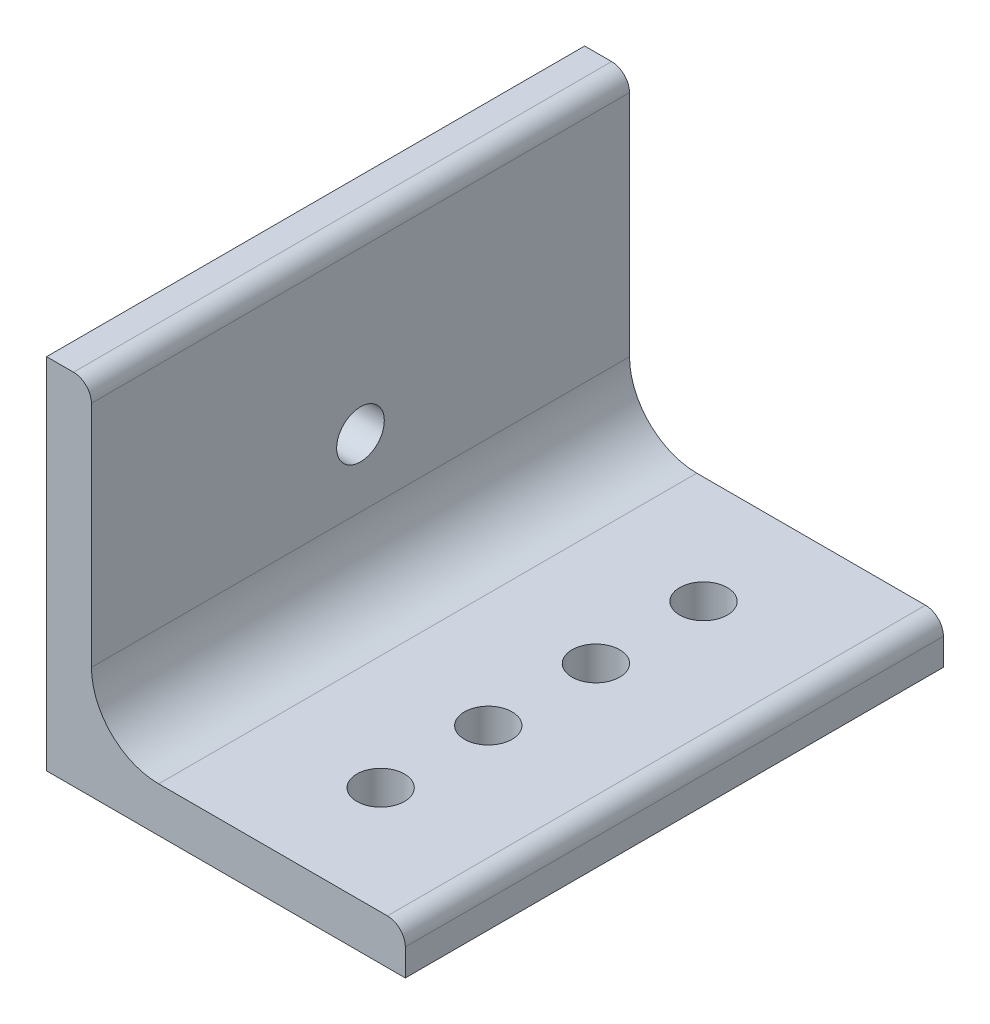
ISO-10303-21;
HEADER;
FILE_DESCRIPTION(('STEP AP214'),'2;1');
FILE_NAME('part.step','',(''),(''),'','','');
FILE_SCHEMA(('AUTOMOTIVE_DESIGN { 1 0 10303 214 1 1 1 1 }'));
ENDSEC;
DATA;
#1=APPLICATION_CONTEXT('core data for automotive mechanical design processes');
#2=APPLICATION_PROTOCOL_DEFINITION('international standard','automotive_design',2000,#1);
#3=PRODUCT_CONTEXT('',#1,'mechanical');
#4=PRODUCT('Part','Part','',(#3));
#5=PRODUCT_RELATED_PRODUCT_CATEGORY('part','',(#4));
#6=PRODUCT_DEFINITION_FORMATION('','',#4);
#7=PRODUCT_DEFINITION_CONTEXT('part definition',#1,'design');
#8=PRODUCT_DEFINITION('design','',#6,#7);
#9=PRODUCT_DEFINITION_SHAPE('','',#8);
#10=(LENGTH_UNIT() NAMED_UNIT(*) SI_UNIT(.MILLI.,.METRE.));
#11=(NAMED_UNIT(*) PLANE_ANGLE_UNIT() SI_UNIT($,.RADIAN.));
#12=(NAMED_UNIT(*) SI_UNIT($,.STERADIAN.) SOLID_ANGLE_UNIT());
#13=UNCERTAINTY_MEASURE_WITH_UNIT(LENGTH_MEASURE(1.E-05),#10,'distance_accuracy_value','');
#14=(GEOMETRIC_REPRESENTATION_CONTEXT(3) GLOBAL_UNCERTAINTY_ASSIGNED_CONTEXT((#13)) GLOBAL_UNIT_ASSIGNED_CONTEXT((#10,
#11,#12)) REPRESENTATION_CONTEXT('',''));
#15=CARTESIAN_POINT('',(0.,0.,0.));
#16=DIRECTION('',(0.,0.,1.));
#17=DIRECTION('',(1.,0.,0.));
#18=AXIS2_PLACEMENT_3D('',#15,#16,#17);
#19=CARTESIAN_POINT('',(19.05,19.05,76.2));
#20=DIRECTION('',(0.,0.,-1.));
#21=DIRECTION('',(-1.,0.,0.));
#22=AXIS2_PLACEMENT_3D('',#19,#20,#21);
#23=CYLINDRICAL_SURFACE('',#22,19.05);
#24=DIRECTION('',(0.,0.,-1.));
#25=VECTOR('',#24,1.);
#26=CARTESIAN_POINT('',(19.05,0.,76.2));
#27=LINE('',#26,#25);
#28=CARTESIAN_POINT('',(19.05,0.,76.2));
#29=VERTEX_POINT('',#28);
#30=CARTESIAN_POINT('',(19.05,0.,-76.2));
#31=VERTEX_POINT('',#30);
#32=EDGE_CURVE('E130',#29,#31,#27,.T.);
#33=ORIENTED_EDGE('',*,*,#32,.T.);
#34=CARTESIAN_POINT('',(19.05,19.05,-76.2));
#35=DIRECTION('',(0.,0.,-1.));
#36=DIRECTION('',(1.,0.,0.));
#37=AXIS2_PLACEMENT_3D('',#34,#35,#36);
#38=CIRCLE('',#37,19.05);
#39=CARTESIAN_POINT('',(0.,19.05,-76.2));
#40=VERTEX_POINT('',#39);
#41=EDGE_CURVE('E124',#31,#40,#38,.T.);
#42=ORIENTED_EDGE('',*,*,#41,.T.);
#43=DIRECTION('',(0.,0.,-1.));
#44=VECTOR('',#43,1.);
#45=CARTESIAN_POINT('',(0.,19.05,76.2));
#46=LINE('',#45,#44);
#47=CARTESIAN_POINT('',(0.,19.05,76.2));
#48=VERTEX_POINT('',#47);
#49=EDGE_CURVE('E11',#48,#40,#46,.T.);
#50=ORIENTED_EDGE('',*,*,#49,.F.);
#51=CARTESIAN_POINT('',(19.05,19.05,76.2));
#52=DIRECTION('',(0.,0.,-1.));
#53=DIRECTION('',(1.,0.,0.));
#54=AXIS2_PLACEMENT_3D('',#51,#52,#53);
#55=CIRCLE('',#54,19.05);
#56=EDGE_CURVE('E156',#29,#48,#55,.T.);
#57=ORIENTED_EDGE('',*,*,#56,.F.);
#58=EDGE_LOOP('',(#33,#42,#50,#57));
#59=FACE_BOUND('',#58,.T.);
#60=ADVANCED_FACE('F42',(#59),#23,.F.);
#61=CARTESIAN_POINT('',(0.,19.05,76.2));
#62=DIRECTION('',(-1.,0.,0.));
#63=DIRECTION('',(0.,-1.,0.));
#64=AXIS2_PLACEMENT_3D('',#61,#62,#63);
#65=PLANE('',#64);
#66=CARTESIAN_POINT('',(0.,38.1,0.));
#67=DIRECTION('',(1.,0.,0.));
#68=DIRECTION('',(0.,0.,-1.));
#69=AXIS2_PLACEMENT_3D('',#66,#67,#68);
#70=CIRCLE('',#69,6.75);
#71=CARTESIAN_POINT('',(0.,38.1,-6.75));
#72=VERTEX_POINT('',#71);
#73=EDGE_CURVE('E134',#72,#72,#70,.T.);
#74=ORIENTED_EDGE('',*,*,#73,.F.);
#75=EDGE_LOOP('',(#74));
#76=FACE_BOUND('',#75,.T.);
#77=ORIENTED_EDGE('',*,*,#49,.T.);
#78=DIRECTION('',(0.,1.,0.));
#79=VECTOR('',#78,1.);
#80=CARTESIAN_POINT('',(0.,19.05,-76.2));
#81=LINE('',#80,#79);
#82=CARTESIAN_POINT('',(0.,83.82,-76.2));
#83=VERTEX_POINT('',#82);
#84=EDGE_CURVE('E114',#40,#83,#81,.T.);
#85=ORIENTED_EDGE('',*,*,#84,.T.);
#86=DIRECTION('',(0.,0.,-1.));
#87=VECTOR('',#86,1.);
#88=CARTESIAN_POINT('',(0.,83.82,76.2));
#89=LINE('',#88,#87);
#90=CARTESIAN_POINT('',(0.,83.82,76.2));
#91=VERTEX_POINT('',#90);
#92=EDGE_CURVE('E49',#91,#83,#89,.T.);
#93=ORIENTED_EDGE('',*,*,#92,.F.);
#94=DIRECTION('',(0.,1.,0.));
#95=VECTOR('',#94,1.);
#96=CARTESIAN_POINT('',(0.,19.05,76.2));
#97=LINE('',#96,#95);
#98=EDGE_CURVE('E115',#48,#91,#97,.T.);
#99=ORIENTED_EDGE('',*,*,#98,.F.);
#100=EDGE_LOOP('',(#77,#85,#93,#99));
#101=FACE_BOUND('',#100,.T.);
#102=ADVANCED_FACE('F112',(#76,#101),#65,.F.);
#103=CARTESIAN_POINT('',(-5.08,83.82,76.2));
#104=DIRECTION('',(0.,0.,-1.));
#105=DIRECTION('',(-1.,0.,0.));
#106=AXIS2_PLACEMENT_3D('',#103,#104,#105);
#107=CYLINDRICAL_SURFACE('',#106,5.08);
#108=ORIENTED_EDGE('',*,*,#92,.T.);
#109=CARTESIAN_POINT('',(-5.08,83.82,-76.2));
#110=DIRECTION('',(0.,0.,1.));
#111=DIRECTION('',(1.,0.,0.));
#112=AXIS2_PLACEMENT_3D('',#109,#110,#111);
#113=CIRCLE('',#112,5.08);
#114=CARTESIAN_POINT('',(-5.08,88.9,-76.2));
#115=VERTEX_POINT('',#114);
#116=EDGE_CURVE('E128',#83,#115,#113,.T.);
#117=ORIENTED_EDGE('',*,*,#116,.T.);
#118=DIRECTION('',(0.,0.,-1.));
#119=VECTOR('',#118,1.);
#120=CARTESIAN_POINT('',(-5.08,88.9,76.2));
#121=LINE('',#120,#119);
#122=CARTESIAN_POINT('',(-5.08,88.9,76.2));
#123=VERTEX_POINT('',#122);
#124=EDGE_CURVE('E182',#123,#115,#121,.T.);
#125=ORIENTED_EDGE('',*,*,#124,.F.);
#126=CARTESIAN_POINT('',(-5.08,83.82,76.2));
#127=DIRECTION('',(0.,0.,1.));
#128=DIRECTION('',(1.,0.,0.));
#129=AXIS2_PLACEMENT_3D('',#126,#127,#128);
#130=CIRCLE('',#129,5.08);
#131=EDGE_CURVE('E159',#91,#123,#130,.T.);
#132=ORIENTED_EDGE('',*,*,#131,.F.);
#133=EDGE_LOOP('',(#108,#117,#125,#132));
#134=FACE_BOUND('',#133,.T.);
#135=ADVANCED_FACE('F185',(#134),#107,.T.);
#136=CARTESIAN_POINT('',(-5.08,88.9,76.2));
#137=DIRECTION('',(0.,-1.,0.));
#138=DIRECTION('',(0.,0.,-1.));
#139=AXIS2_PLACEMENT_3D('',#136,#137,#138);
#140=PLANE('',#139);
#141=ORIENTED_EDGE('',*,*,#124,.T.);
#142=DIRECTION('',(-1.,0.,0.));
#143=VECTOR('',#142,1.);
#144=CARTESIAN_POINT('',(-5.08,88.9,-76.2));
#145=LINE('',#144,#143);
#146=CARTESIAN_POINT('',(-12.7,88.9,-76.2));
#147=VERTEX_POINT('',#146);
#148=EDGE_CURVE('E139',#115,#147,#145,.T.);
#149=ORIENTED_EDGE('',*,*,#148,.T.);
#150=DIRECTION('',(0.,0.,-1.));
#151=VECTOR('',#150,1.);
#152=CARTESIAN_POINT('',(-12.7,88.9,76.2));
#153=LINE('',#152,#151);
#154=CARTESIAN_POINT('',(-12.7,88.9,76.2));
#155=VERTEX_POINT('',#154);
#156=EDGE_CURVE('E180',#155,#147,#153,.T.);
#157=ORIENTED_EDGE('',*,*,#156,.F.);
#158=DIRECTION('',(-1.,0.,0.));
#159=VECTOR('',#158,1.);
#160=CARTESIAN_POINT('',(-5.08,88.9,76.2));
#161=LINE('',#160,#159);
#162=EDGE_CURVE('E161',#123,#155,#161,.T.);
#163=ORIENTED_EDGE('',*,*,#162,.F.);
#164=EDGE_LOOP('',(#141,#149,#157,#163));
#165=FACE_BOUND('',#164,.T.);
#166=ADVANCED_FACE('F193',(#165),#140,.F.);
#167=CARTESIAN_POINT('',(-12.7,88.9,76.2));
#168=DIRECTION('',(1.,0.,0.));
#169=DIRECTION('',(0.,1.,0.));
#170=AXIS2_PLACEMENT_3D('',#167,#168,#169);
#171=PLANE('',#170);
#172=CARTESIAN_POINT('',(-12.7,38.1,0.));
#173=DIRECTION('',(1.,0.,0.));
#174=DIRECTION('',(0.,0.,-1.));
#175=AXIS2_PLACEMENT_3D('',#172,#173,#174);
#176=CIRCLE('',#175,6.75);
#177=CARTESIAN_POINT('',(-12.7,38.1,-6.75));
#178=VERTEX_POINT('',#177);
#179=EDGE_CURVE('E131',#178,#178,#176,.T.);
#180=ORIENTED_EDGE('',*,*,#179,.T.);
#181=EDGE_LOOP('',(#180));
#182=FACE_BOUND('',#181,.T.);
#183=ORIENTED_EDGE('',*,*,#156,.T.);
#184=DIRECTION('',(0.,-1.,0.));
#185=VECTOR('',#184,1.);
#186=CARTESIAN_POINT('',(-12.7,88.9,-76.2));
#187=LINE('',#186,#185);
#188=CARTESIAN_POINT('',(-12.7,-12.7,-76.2));
#189=VERTEX_POINT('',#188);
#190=EDGE_CURVE('E142',#147,#189,#187,.T.);
#191=ORIENTED_EDGE('',*,*,#190,.T.);
#192=DIRECTION('',(0.,0.,-1.));
#193=VECTOR('',#192,1.);
#194=CARTESIAN_POINT('',(-12.7,-12.7,76.2));
#195=LINE('',#194,#193);
#196=CARTESIAN_POINT('',(-12.7,-12.7,76.2));
#197=VERTEX_POINT('',#196);
#198=EDGE_CURVE('E178',#197,#189,#195,.T.);
#199=ORIENTED_EDGE('',*,*,#198,.F.);
#200=DIRECTION('',(0.,-1.,0.));
#201=VECTOR('',#200,1.);
#202=CARTESIAN_POINT('',(-12.7,88.9,76.2));
#203=LINE('',#202,#201);
#204=EDGE_CURVE('E163',#155,#197,#203,.T.);
#205=ORIENTED_EDGE('',*,*,#204,.F.);
#206=EDGE_LOOP('',(#183,#191,#199,#205));
#207=FACE_BOUND('',#206,.T.);
#208=ADVANCED_FACE('F196',(#182,#207),#171,.F.);
#209=CARTESIAN_POINT('',(-12.7,-12.7,76.2));
#210=DIRECTION('',(0.,1.,0.));
#211=DIRECTION('',(-1.,0.,0.));
#212=AXIS2_PLACEMENT_3D('',#209,#210,#211);
#213=PLANE('',#212);
#214=CARTESIAN_POINT('',(51.435,-12.7,-45.72));
#215=DIRECTION('',(0.,1.,0.));
#216=DIRECTION('',(0.,0.,1.));
#217=AXIS2_PLACEMENT_3D('',#214,#215,#216);
#218=CIRCLE('',#217,6.74623999999999);
#219=CARTESIAN_POINT('',(51.435,-12.7,-38.97376));
#220=VERTEX_POINT('',#219);
#221=EDGE_CURVE('E322',#220,#220,#218,.T.);
#222=ORIENTED_EDGE('',*,*,#221,.T.);
#223=EDGE_LOOP('',(#222));
#224=FACE_BOUND('',#223,.T.);
#225=CARTESIAN_POINT('',(51.435,-12.7,-15.24));
#226=DIRECTION('',(0.,1.,0.));
#227=DIRECTION('',(0.,0.,1.));
#228=AXIS2_PLACEMENT_3D('',#225,#226,#227);
#229=CIRCLE('',#228,6.74623999999999);
#230=CARTESIAN_POINT('',(51.435,-12.7,-8.49376000000002));
#231=VERTEX_POINT('',#230);
#232=EDGE_CURVE('E331',#231,#231,#229,.T.);
#233=ORIENTED_EDGE('',*,*,#232,.T.);
#234=EDGE_LOOP('',(#233));
#235=FACE_BOUND('',#234,.T.);
#236=CARTESIAN_POINT('',(51.435,-12.7,15.24));
#237=DIRECTION('',(0.,1.,0.));
#238=DIRECTION('',(0.,0.,1.));
#239=AXIS2_PLACEMENT_3D('',#236,#237,#238);
#240=CIRCLE('',#239,6.74624);
#241=CARTESIAN_POINT('',(51.435,-12.7,21.98624));
#242=VERTEX_POINT('',#241);
#243=EDGE_CURVE('E337',#242,#242,#240,.T.);
#244=ORIENTED_EDGE('',*,*,#243,.T.);
#245=EDGE_LOOP('',(#244));
#246=FACE_BOUND('',#245,.T.);
#247=CARTESIAN_POINT('',(51.435,-12.7,45.72));
#248=DIRECTION('',(0.,1.,0.));
#249=DIRECTION('',(0.,0.,1.));
#250=AXIS2_PLACEMENT_3D('',#247,#248,#249);
#251=CIRCLE('',#250,6.74624);
#252=CARTESIAN_POINT('',(51.435,-12.7,52.46624));
#253=VERTEX_POINT('',#252);
#254=EDGE_CURVE('E343',#253,#253,#251,.T.);
#255=ORIENTED_EDGE('',*,*,#254,.T.);
#256=EDGE_LOOP('',(#255));
#257=FACE_BOUND('',#256,.T.);
#258=ORIENTED_EDGE('',*,*,#198,.T.);
#259=DIRECTION('',(1.,0.,0.));
#260=VECTOR('',#259,1.);
#261=CARTESIAN_POINT('',(-12.7,-12.7,-76.2));
#262=LINE('',#261,#260);
#263=CARTESIAN_POINT('',(88.9,-12.7,-76.2));
#264=VERTEX_POINT('',#263);
#265=EDGE_CURVE('E145',#189,#264,#262,.T.);
#266=ORIENTED_EDGE('',*,*,#265,.T.);
#267=DIRECTION('',(0.,0.,-1.));
#268=VECTOR('',#267,1.);
#269=CARTESIAN_POINT('',(88.9,-12.7,76.2));
#270=LINE('',#269,#268);
#271=CARTESIAN_POINT('',(88.9,-12.7,76.2));
#272=VERTEX_POINT('',#271);
#273=EDGE_CURVE('E176',#272,#264,#270,.T.);
#274=ORIENTED_EDGE('',*,*,#273,.F.);
#275=DIRECTION('',(1.,0.,0.));
#276=VECTOR('',#275,1.);
#277=CARTESIAN_POINT('',(-12.7,-12.7,76.2));
#278=LINE('',#277,#276);
#279=EDGE_CURVE('E165',#197,#272,#278,.T.);
#280=ORIENTED_EDGE('',*,*,#279,.F.);
#281=EDGE_LOOP('',(#258,#266,#274,#280));
#282=FACE_BOUND('',#281,.T.);
#283=ADVANCED_FACE('F201',(#224,#235,#246,#257,#282),#213,.F.);
#284=CARTESIAN_POINT('',(88.9,-12.7,76.2));
#285=DIRECTION('',(-1.,0.,0.));
#286=DIRECTION('',(0.,0.,1.));
#287=AXIS2_PLACEMENT_3D('',#284,#285,#286);
#288=PLANE('',#287);
#289=ORIENTED_EDGE('',*,*,#273,.T.);
#290=DIRECTION('',(0.,1.,0.));
#291=VECTOR('',#290,1.);
#292=CARTESIAN_POINT('',(88.9,-12.7,-76.2));
#293=LINE('',#292,#291);
#294=CARTESIAN_POINT('',(88.9,-5.08,-76.2));
#295=VERTEX_POINT('',#294);
#296=EDGE_CURVE('E148',#264,#295,#293,.T.);
#297=ORIENTED_EDGE('',*,*,#296,.T.);
#298=DIRECTION('',(0.,0.,-1.));
#299=VECTOR('',#298,1.);
#300=CARTESIAN_POINT('',(88.9,-5.08,76.2));
#301=LINE('',#300,#299);
#302=CARTESIAN_POINT('',(88.9,-5.08,76.2));
#303=VERTEX_POINT('',#302);
#304=EDGE_CURVE('E174',#303,#295,#301,.T.);
#305=ORIENTED_EDGE('',*,*,#304,.F.);
#306=DIRECTION('',(0.,1.,0.));
#307=VECTOR('',#306,1.);
#308=CARTESIAN_POINT('',(88.9,-12.7,76.2));
#309=LINE('',#308,#307);
#310=EDGE_CURVE('E167',#272,#303,#309,.T.);
#311=ORIENTED_EDGE('',*,*,#310,.F.);
#312=EDGE_LOOP('',(#289,#297,#305,#311));
#313=FACE_BOUND('',#312,.T.);
#314=ADVANCED_FACE('F205',(#313),#288,.F.);
#315=CARTESIAN_POINT('',(83.82,-5.08,76.2));
#316=DIRECTION('',(0.,0.,-1.));
#317=DIRECTION('',(-1.,0.,0.));
#318=AXIS2_PLACEMENT_3D('',#315,#316,#317);
#319=CYLINDRICAL_SURFACE('',#318,5.08);
#320=ORIENTED_EDGE('',*,*,#304,.T.);
#321=CARTESIAN_POINT('',(83.82,-5.08,-76.2));
#322=DIRECTION('',(0.,0.,1.));
#323=DIRECTION('',(1.,0.,0.));
#324=AXIS2_PLACEMENT_3D('',#321,#322,#323);
#325=CIRCLE('',#324,5.08);
#326=CARTESIAN_POINT('',(83.82,0.,-76.2));
#327=VERTEX_POINT('',#326);
#328=EDGE_CURVE('E151',#295,#327,#325,.T.);
#329=ORIENTED_EDGE('',*,*,#328,.T.);
#330=DIRECTION('',(0.,0.,-1.));
#331=VECTOR('',#330,1.);
#332=CARTESIAN_POINT('',(83.82,0.,76.2));
#333=LINE('',#332,#331);
#334=CARTESIAN_POINT('',(83.82,0.,76.2));
#335=VERTEX_POINT('',#334);
#336=EDGE_CURVE('E172',#335,#327,#333,.T.);
#337=ORIENTED_EDGE('',*,*,#336,.F.);
#338=CARTESIAN_POINT('',(83.82,-5.08,76.2));
#339=DIRECTION('',(0.,0.,1.));
#340=DIRECTION('',(1.,0.,0.));
#341=AXIS2_PLACEMENT_3D('',#338,#339,#340);
#342=CIRCLE('',#341,5.08);
#343=EDGE_CURVE('E61',#303,#335,#342,.T.);
#344=ORIENTED_EDGE('',*,*,#343,.F.);
#345=EDGE_LOOP('',(#320,#329,#337,#344));
#346=FACE_BOUND('',#345,.T.);
#347=ADVANCED_FACE('F209',(#346),#319,.T.);
#348=CARTESIAN_POINT('',(83.82,0.,76.2));
#349=DIRECTION('',(0.,-1.,0.));
#350=DIRECTION('',(1.,0.,0.));
#351=AXIS2_PLACEMENT_3D('',#348,#349,#350);
#352=PLANE('',#351);
#353=CARTESIAN_POINT('',(51.435,0.,-45.72));
#354=DIRECTION('',(0.,1.,0.));
#355=DIRECTION('',(0.,0.,1.));
#356=AXIS2_PLACEMENT_3D('',#353,#354,#355);
#357=CIRCLE('',#356,6.74624);
#358=CARTESIAN_POINT('',(51.435,0.,-38.97376));
#359=VERTEX_POINT('',#358);
#360=EDGE_CURVE('E324',#359,#359,#357,.T.);
#361=ORIENTED_EDGE('',*,*,#360,.F.);
#362=EDGE_LOOP('',(#361));
#363=FACE_BOUND('',#362,.T.);
#364=CARTESIAN_POINT('',(51.435,0.,-15.24));
#365=DIRECTION('',(0.,1.,0.));
#366=DIRECTION('',(0.,0.,1.));
#367=AXIS2_PLACEMENT_3D('',#364,#365,#366);
#368=CIRCLE('',#367,6.74624);
#369=CARTESIAN_POINT('',(51.435,0.,-8.49376000000002));
#370=VERTEX_POINT('',#369);
#371=EDGE_CURVE('E326',#370,#370,#368,.T.);
#372=ORIENTED_EDGE('',*,*,#371,.F.);
#373=EDGE_LOOP('',(#372));
#374=FACE_BOUND('',#373,.T.);
#375=CARTESIAN_POINT('',(51.435,0.,15.24));
#376=DIRECTION('',(0.,1.,0.));
#377=DIRECTION('',(0.,0.,1.));
#378=AXIS2_PLACEMENT_3D('',#375,#376,#377);
#379=CIRCLE('',#378,6.74624);
#380=CARTESIAN_POINT('',(51.435,0.,21.98624));
#381=VERTEX_POINT('',#380);
#382=EDGE_CURVE('E334',#381,#381,#379,.T.);
#383=ORIENTED_EDGE('',*,*,#382,.F.);
#384=EDGE_LOOP('',(#383));
#385=FACE_BOUND('',#384,.T.);
#386=CARTESIAN_POINT('',(51.435,0.,45.72));
#387=DIRECTION('',(0.,1.,0.));
#388=DIRECTION('',(0.,0.,1.));
#389=AXIS2_PLACEMENT_3D('',#386,#387,#388);
#390=CIRCLE('',#389,6.74624);
#391=CARTESIAN_POINT('',(51.435,0.,52.46624));
#392=VERTEX_POINT('',#391);
#393=EDGE_CURVE('E340',#392,#392,#390,.T.);
#394=ORIENTED_EDGE('',*,*,#393,.F.);
#395=EDGE_LOOP('',(#394));
#396=FACE_BOUND('',#395,.T.);
#397=ORIENTED_EDGE('',*,*,#336,.T.);
#398=DIRECTION('',(-1.,0.,0.));
#399=VECTOR('',#398,1.);
#400=CARTESIAN_POINT('',(83.82,0.,-76.2));
#401=LINE('',#400,#399);
#402=EDGE_CURVE('E154',#327,#31,#401,.T.);
#403=ORIENTED_EDGE('',*,*,#402,.T.);
#404=ORIENTED_EDGE('',*,*,#32,.F.);
#405=DIRECTION('',(-1.,0.,0.));
#406=VECTOR('',#405,1.);
#407=CARTESIAN_POINT('',(83.82,0.,76.2));
#408=LINE('',#407,#406);
#409=EDGE_CURVE('E56',#335,#29,#408,.T.);
#410=ORIENTED_EDGE('',*,*,#409,.F.);
#411=EDGE_LOOP('',(#397,#403,#404,#410));
#412=FACE_BOUND('',#411,.T.);
#413=ADVANCED_FACE('F211',(#363,#374,#385,#396,#412),#352,.F.);
#414=CARTESIAN_POINT('',(19.05,19.05,76.2));
#415=DIRECTION('',(0.,0.,1.));
#416=DIRECTION('',(1.,0.,0.));
#417=AXIS2_PLACEMENT_3D('',#414,#415,#416);
#418=PLANE('',#417);
#419=ORIENTED_EDGE('',*,*,#56,.T.);
#420=ORIENTED_EDGE('',*,*,#98,.T.);
#421=ORIENTED_EDGE('',*,*,#131,.T.);
#422=ORIENTED_EDGE('',*,*,#162,.T.);
#423=ORIENTED_EDGE('',*,*,#204,.T.);
#424=ORIENTED_EDGE('',*,*,#279,.T.);
#425=ORIENTED_EDGE('',*,*,#310,.T.);
#426=ORIENTED_EDGE('',*,*,#343,.T.);
#427=ORIENTED_EDGE('',*,*,#409,.T.);
#428=EDGE_LOOP('',(#419,#420,#421,#422,#423,#424,#425,#426,#427));
#429=FACE_BOUND('',#428,.T.);
#430=ADVANCED_FACE('F188',(#429),#418,.T.);
#431=CARTESIAN_POINT('',(19.05,19.05,-76.2));
#432=DIRECTION('',(0.,0.,1.));
#433=DIRECTION('',(1.,0.,0.));
#434=AXIS2_PLACEMENT_3D('',#431,#432,#433);
#435=PLANE('',#434);
#436=ORIENTED_EDGE('',*,*,#41,.F.);
#437=ORIENTED_EDGE('',*,*,#402,.F.);
#438=ORIENTED_EDGE('',*,*,#328,.F.);
#439=ORIENTED_EDGE('',*,*,#296,.F.);
#440=ORIENTED_EDGE('',*,*,#265,.F.);
#441=ORIENTED_EDGE('',*,*,#190,.F.);
#442=ORIENTED_EDGE('',*,*,#148,.F.);
#443=ORIENTED_EDGE('',*,*,#116,.F.);
#444=ORIENTED_EDGE('',*,*,#84,.F.);
#445=EDGE_LOOP('',(#436,#437,#438,#439,#440,#441,#442,#443,#444));
#446=FACE_BOUND('',#445,.T.);
#447=ADVANCED_FACE('F122',(#446),#435,.F.);
#448=CARTESIAN_POINT('',(0.,38.1,0.));
#449=DIRECTION('',(1.,0.,0.));
#450=DIRECTION('',(0.,0.,-1.));
#451=AXIS2_PLACEMENT_3D('',#448,#449,#450);
#452=CYLINDRICAL_SURFACE('',#451,6.75);
#453=ORIENTED_EDGE('',*,*,#179,.F.);
#454=EDGE_LOOP('',(#453));
#455=FACE_BOUND('',#454,.T.);
#456=ORIENTED_EDGE('',*,*,#73,.T.);
#457=EDGE_LOOP('',(#456));
#458=FACE_BOUND('',#457,.T.);
#459=ADVANCED_FACE('F266',(#455,#458),#452,.F.);
#460=CARTESIAN_POINT('',(51.435,0.,45.72));
#461=DIRECTION('',(0.,1.,0.));
#462=DIRECTION('',(0.,0.,1.));
#463=AXIS2_PLACEMENT_3D('',#460,#461,#462);
#464=CYLINDRICAL_SURFACE('',#463,6.74624);
#465=ORIENTED_EDGE('',*,*,#254,.F.);
#466=EDGE_LOOP('',(#465));
#467=FACE_BOUND('',#466,.T.);
#468=ORIENTED_EDGE('',*,*,#393,.T.);
#469=EDGE_LOOP('',(#468));
#470=FACE_BOUND('',#469,.T.);
#471=ADVANCED_FACE('F277',(#467,#470),#464,.F.);
#472=CARTESIAN_POINT('',(51.435,0.,15.24));
#473=DIRECTION('',(0.,1.,0.));
#474=DIRECTION('',(0.,0.,1.));
#475=AXIS2_PLACEMENT_3D('',#472,#473,#474);
#476=CYLINDRICAL_SURFACE('',#475,6.74624);
#477=ORIENTED_EDGE('',*,*,#243,.F.);
#478=EDGE_LOOP('',(#477));
#479=FACE_BOUND('',#478,.T.);
#480=ORIENTED_EDGE('',*,*,#382,.T.);
#481=EDGE_LOOP('',(#480));
#482=FACE_BOUND('',#481,.T.);
#483=ADVANCED_FACE('F286',(#479,#482),#476,.F.);
#484=CARTESIAN_POINT('',(51.435,0.,-15.24));
#485=DIRECTION('',(0.,1.,0.));
#486=DIRECTION('',(0.,0.,1.));
#487=AXIS2_PLACEMENT_3D('',#484,#485,#486);
#488=CYLINDRICAL_SURFACE('',#487,6.74624);
#489=ORIENTED_EDGE('',*,*,#232,.F.);
#490=EDGE_LOOP('',(#489));
#491=FACE_BOUND('',#490,.T.);
#492=ORIENTED_EDGE('',*,*,#371,.T.);
#493=EDGE_LOOP('',(#492));
#494=FACE_BOUND('',#493,.T.);
#495=ADVANCED_FACE('F296',(#491,#494),#488,.F.);
#496=CARTESIAN_POINT('',(51.435,0.,-45.72));
#497=DIRECTION('',(0.,1.,0.));
#498=DIRECTION('',(0.,0.,1.));
#499=AXIS2_PLACEMENT_3D('',#496,#497,#498);
#500=CYLINDRICAL_SURFACE('',#499,6.74624);
#501=ORIENTED_EDGE('',*,*,#221,.F.);
#502=EDGE_LOOP('',(#501));
#503=FACE_BOUND('',#502,.T.);
#504=ORIENTED_EDGE('',*,*,#360,.T.);
#505=EDGE_LOOP('',(#504));
#506=FACE_BOUND('',#505,.T.);
#507=ADVANCED_FACE('F306',(#503,#506),#500,.F.);
#508=CLOSED_SHELL('',(#60,#102,#135,#166,#208,#283,#314,#347,#413,#430,#447,#459,#471,#483,#495,#507));
#509=MANIFOLD_SOLID_BREP('B2',#508);
#510=ADVANCED_BREP_SHAPE_REPRESENTATION('',(#18,#509),#14);
#511=SHAPE_DEFINITION_REPRESENTATION(#9,#510);
ENDSEC;
END-ISO-10303-21;
